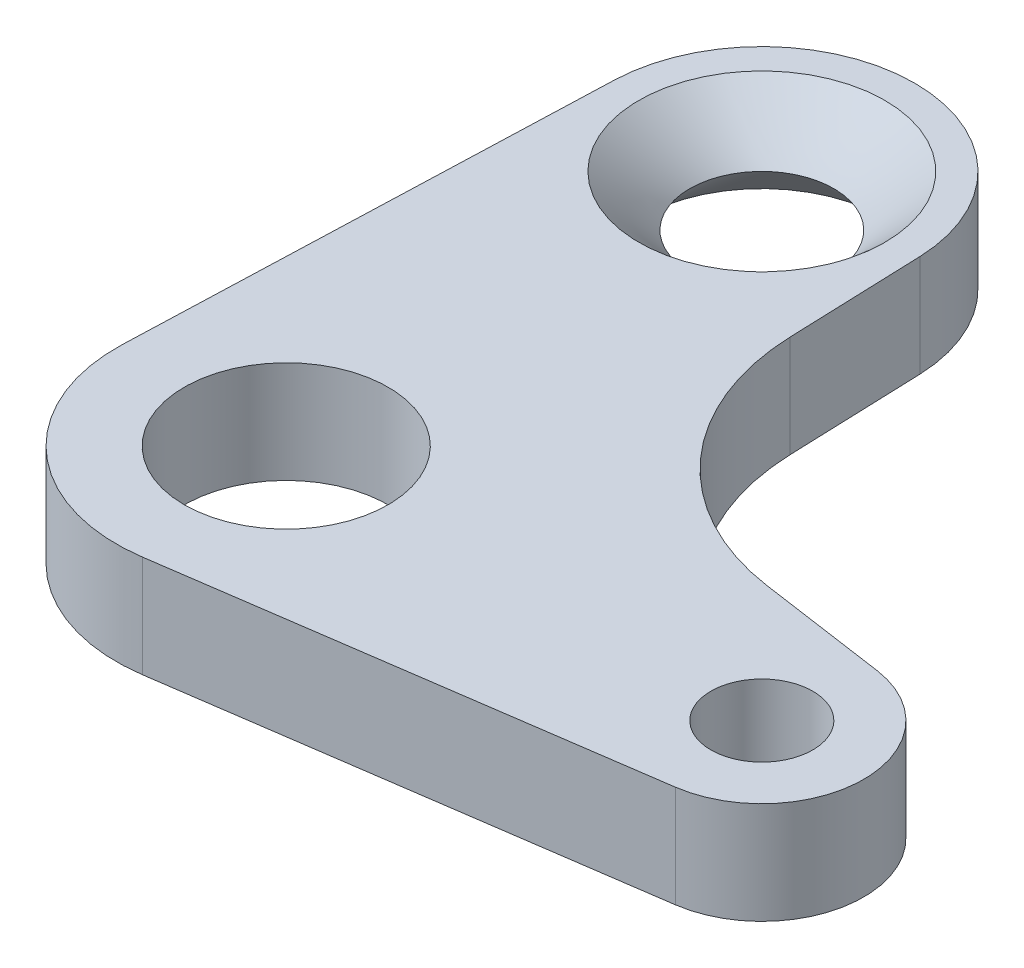
ISO-10303-21;
HEADER;
FILE_DESCRIPTION(('STEP AP214'),'2;1');
FILE_NAME('part.step','',(''),(''),'','','');
FILE_SCHEMA(('AUTOMOTIVE_DESIGN { 1 0 10303 214 1 1 1 1 }'));
ENDSEC;
DATA;
#1=APPLICATION_CONTEXT('core data for automotive mechanical design processes');
#2=APPLICATION_PROTOCOL_DEFINITION('international standard','automotive_design',2000,#1);
#3=PRODUCT_CONTEXT('',#1,'mechanical');
#4=PRODUCT('Part','Part','',(#3));
#5=PRODUCT_RELATED_PRODUCT_CATEGORY('part','',(#4));
#6=PRODUCT_DEFINITION_FORMATION('','',#4);
#7=PRODUCT_DEFINITION_CONTEXT('part definition',#1,'design');
#8=PRODUCT_DEFINITION('design','',#6,#7);
#9=PRODUCT_DEFINITION_SHAPE('','',#8);
#10=(LENGTH_UNIT() NAMED_UNIT(*) SI_UNIT(.MILLI.,.METRE.));
#11=(NAMED_UNIT(*) PLANE_ANGLE_UNIT() SI_UNIT($,.RADIAN.));
#12=(NAMED_UNIT(*) SI_UNIT($,.STERADIAN.) SOLID_ANGLE_UNIT());
#13=UNCERTAINTY_MEASURE_WITH_UNIT(LENGTH_MEASURE(1.E-05),#10,'distance_accuracy_value','');
#14=(GEOMETRIC_REPRESENTATION_CONTEXT(3) GLOBAL_UNCERTAINTY_ASSIGNED_CONTEXT((#13)) GLOBAL_UNIT_ASSIGNED_CONTEXT((#10,
#11,#12)) REPRESENTATION_CONTEXT('',''));
#15=CARTESIAN_POINT('',(0.,0.,0.));
#16=DIRECTION('',(0.,0.,1.));
#17=DIRECTION('',(1.,0.,0.));
#18=AXIS2_PLACEMENT_3D('',#15,#16,#17);
#19=CARTESIAN_POINT('',(0.,1.5,-14.));
#20=DIRECTION('',(0.,1.,0.));
#21=DIRECTION('',(0.,0.,1.));
#22=AXIS2_PLACEMENT_3D('',#19,#20,#21);
#23=PLANE('',#22);
#24=CARTESIAN_POINT('',(0.,1.5,-14.));
#25=DIRECTION('',(0.,1.,0.));
#26=DIRECTION('',(0.,0.,1.));
#27=AXIS2_PLACEMENT_3D('',#24,#25,#26);
#28=CIRCLE('',#27,3.6213);
#29=CARTESIAN_POINT('',(-3.05145372455657,1.5,-15.9499856042776));
#30=VERTEX_POINT('',#29);
#31=EDGE_CURVE('E155',#30,#30,#28,.T.);
#32=ORIENTED_EDGE('',*,*,#31,.F.);
#33=EDGE_LOOP('',(#32));
#34=FACE_BOUND('',#33,.T.);
#35=CARTESIAN_POINT('',(0.,1.5,0.));
#36=DIRECTION('',(0.,1.,0.));
#37=DIRECTION('',(0.,0.,1.));
#38=AXIS2_PLACEMENT_3D('',#35,#36,#37);
#39=CIRCLE('',#38,3.);
#40=CARTESIAN_POINT('',(0.,1.5,3.));
#41=VERTEX_POINT('',#40);
#42=EDGE_CURVE('E350',#41,#41,#39,.T.);
#43=ORIENTED_EDGE('',*,*,#42,.F.);
#44=EDGE_LOOP('',(#43));
#45=FACE_BOUND('',#44,.T.);
#46=CARTESIAN_POINT('',(0.,1.5,-14.));
#47=DIRECTION('',(0.,1.,0.));
#48=DIRECTION('',(0.,0.,1.));
#49=AXIS2_PLACEMENT_3D('',#46,#47,#48);
#50=CIRCLE('',#49,4.5);
#51=CARTESIAN_POINT('',(4.49712918631068,1.5,-14.1607142857143));
#52=VERTEX_POINT('',#51);
#53=CARTESIAN_POINT('',(-4.49712918631068,1.5,-14.1607142857143));
#54=VERTEX_POINT('',#53);
#55=EDGE_CURVE('E125',#52,#54,#50,.T.);
#56=ORIENTED_EDGE('',*,*,#55,.T.);
#57=DIRECTION('',(-0.0357142857142858,0.,0.999362041402373));
#58=VECTOR('',#57,1.);
#59=CARTESIAN_POINT('',(-4.49712918631068,1.5,-14.1607142857143));
#60=LINE('',#59,#58);
#61=CARTESIAN_POINT('',(-4.99681020701187,1.5,-0.17857142857143));
#62=VERTEX_POINT('',#61);
#63=EDGE_CURVE('E113',#54,#62,#60,.T.);
#64=ORIENTED_EDGE('',*,*,#63,.T.);
#65=CARTESIAN_POINT('',(0.,1.5,0.));
#66=DIRECTION('',(0.,1.,0.));
#67=DIRECTION('',(0.,0.,1.));
#68=AXIS2_PLACEMENT_3D('',#65,#66,#67);
#69=CIRCLE('',#68,5.);
#70=CARTESIAN_POINT('',(0.714285714285717,1.5,4.94871659305394));
#71=VERTEX_POINT('',#70);
#72=EDGE_CURVE('E124',#62,#71,#69,.T.);
#73=ORIENTED_EDGE('',*,*,#72,.T.);
#74=DIRECTION('',(0.989743318610787,0.,-0.142857142857143));
#75=VECTOR('',#74,1.);
#76=CARTESIAN_POINT('',(0.714285714285715,1.5,4.94871659305394));
#77=LINE('',#76,#75);
#78=CARTESIAN_POINT('',(14.4285714285714,1.5,2.96922995583236));
#79=VERTEX_POINT('',#78);
#80=EDGE_CURVE('E359',#71,#79,#77,.T.);
#81=ORIENTED_EDGE('',*,*,#80,.T.);
#82=CARTESIAN_POINT('',(14.,1.5,0.));
#83=DIRECTION('',(0.,1.,0.));
#84=DIRECTION('',(0.,0.,1.));
#85=AXIS2_PLACEMENT_3D('',#82,#83,#84);
#86=CIRCLE('',#85,3.);
#87=CARTESIAN_POINT('',(14.4285714285714,1.5,-2.96922995583236));
#88=VERTEX_POINT('',#87);
#89=EDGE_CURVE('E362',#79,#88,#86,.T.);
#90=ORIENTED_EDGE('',*,*,#89,.T.);
#91=DIRECTION('',(-0.989743318610787,0.,-0.142857142857143));
#92=VECTOR('',#91,1.);
#93=CARTESIAN_POINT('',(14.4285714285714,1.5,-2.96922995583236));
#94=LINE('',#93,#92);
#95=CARTESIAN_POINT('',(10.6343837908961,1.5,-3.51687376932432));
#96=VERTEX_POINT('',#95);
#97=EDGE_CURVE('E365',#88,#96,#94,.T.);
#98=ORIENTED_EDGE('',*,*,#97,.T.);
#99=CARTESIAN_POINT('',(11.6343837908961,1.5,-10.4450769995998));
#100=DIRECTION('',(0.,1.,0.));
#101=DIRECTION('',(0.,0.,1.));
#102=AXIS2_PLACEMENT_3D('',#99,#100,#101);
#103=CIRCLE('',#102,7.);
#104=CARTESIAN_POINT('',(4.63884950107946,1.5,-10.1950769995998));
#105=VERTEX_POINT('',#104);
#106=EDGE_CURVE('E12',#96,#105,#103,.F.);
#107=ORIENTED_EDGE('',*,*,#106,.T.);
#108=DIRECTION('',(-0.0357142857142856,0.,-0.999362041402373));
#109=VECTOR('',#108,1.);
#110=CARTESIAN_POINT('',(4.49712918631068,1.5,-14.1607142857143));
#111=LINE('',#110,#109);
#112=EDGE_CURVE('E130',#105,#52,#111,.T.);
#113=ORIENTED_EDGE('',*,*,#112,.T.);
#114=EDGE_LOOP('',(#56,#64,#73,#81,#90,#98,#107,#113));
#115=FACE_BOUND('',#114,.T.);
#116=CARTESIAN_POINT('',(14.,1.5,0.));
#117=DIRECTION('',(0.,1.,0.));
#118=DIRECTION('',(0.,0.,1.));
#119=AXIS2_PLACEMENT_3D('',#116,#117,#118);
#120=CIRCLE('',#119,1.5);
#121=CARTESIAN_POINT('',(14.,1.5,1.5));
#122=VERTEX_POINT('',#121);
#123=EDGE_CURVE('E342',#122,#122,#120,.T.);
#124=ORIENTED_EDGE('',*,*,#123,.F.);
#125=EDGE_LOOP('',(#124));
#126=FACE_BOUND('',#125,.T.);
#127=ADVANCED_FACE('F43',(#34,#45,#115,#126),#23,.T.);
#128=CARTESIAN_POINT('',(0.,-1.5,-14.));
#129=DIRECTION('',(0.,1.,0.));
#130=DIRECTION('',(0.,0.,1.));
#131=AXIS2_PLACEMENT_3D('',#128,#129,#130);
#132=PLANE('',#131);
#133=CARTESIAN_POINT('',(0.,-1.5,-14.));
#134=DIRECTION('',(0.,1.,0.));
#135=DIRECTION('',(0.,0.,1.));
#136=AXIS2_PLACEMENT_3D('',#133,#134,#135);
#137=CIRCLE('',#136,3.6213);
#138=CARTESIAN_POINT('',(-3.05145372455657,-1.5,-15.9499856042776));
#139=VERTEX_POINT('',#138);
#140=EDGE_CURVE('E313',#139,#139,#137,.T.);
#141=ORIENTED_EDGE('',*,*,#140,.T.);
#142=EDGE_LOOP('',(#141));
#143=FACE_BOUND('',#142,.T.);
#144=CARTESIAN_POINT('',(0.,-1.5,-14.));
#145=DIRECTION('',(0.,1.,0.));
#146=DIRECTION('',(0.,0.,1.));
#147=AXIS2_PLACEMENT_3D('',#144,#145,#146);
#148=CIRCLE('',#147,4.5);
#149=CARTESIAN_POINT('',(4.49712918631068,-1.5,-14.1607142857143));
#150=VERTEX_POINT('',#149);
#151=CARTESIAN_POINT('',(-4.49712918631068,-1.5,-14.1607142857143));
#152=VERTEX_POINT('',#151);
#153=EDGE_CURVE('E139',#150,#152,#148,.T.);
#154=ORIENTED_EDGE('',*,*,#153,.F.);
#155=DIRECTION('',(-0.0357142857142856,0.,-0.999362041402373));
#156=VECTOR('',#155,1.);
#157=CARTESIAN_POINT('',(4.49712918631068,-1.5,-14.1607142857143));
#158=LINE('',#157,#156);
#159=CARTESIAN_POINT('',(4.63884950107946,-1.5,-10.1950769995998));
#160=VERTEX_POINT('',#159);
#161=EDGE_CURVE('E135',#160,#150,#158,.T.);
#162=ORIENTED_EDGE('',*,*,#161,.F.);
#163=CARTESIAN_POINT('',(11.6343837908961,-1.5,-10.4450769995998));
#164=DIRECTION('',(0.,1.,0.));
#165=DIRECTION('',(0.,0.,1.));
#166=AXIS2_PLACEMENT_3D('',#163,#164,#165);
#167=CIRCLE('',#166,7.);
#168=CARTESIAN_POINT('',(10.6343837908961,-1.5,-3.51687376932432));
#169=VERTEX_POINT('',#168);
#170=EDGE_CURVE('E55',#160,#169,#167,.T.);
#171=ORIENTED_EDGE('',*,*,#170,.T.);
#172=DIRECTION('',(-0.989743318610787,0.,-0.142857142857143));
#173=VECTOR('',#172,1.);
#174=CARTESIAN_POINT('',(14.4285714285714,-1.5,-2.96922995583236));
#175=LINE('',#174,#173);
#176=CARTESIAN_POINT('',(14.4285714285714,-1.5,-2.96922995583236));
#177=VERTEX_POINT('',#176);
#178=EDGE_CURVE('E385',#177,#169,#175,.T.);
#179=ORIENTED_EDGE('',*,*,#178,.F.);
#180=CARTESIAN_POINT('',(14.,-1.5,0.));
#181=DIRECTION('',(0.,1.,0.));
#182=DIRECTION('',(0.,0.,1.));
#183=AXIS2_PLACEMENT_3D('',#180,#181,#182);
#184=CIRCLE('',#183,3.);
#185=CARTESIAN_POINT('',(14.4285714285714,-1.5,2.96922995583236));
#186=VERTEX_POINT('',#185);
#187=EDGE_CURVE('E382',#186,#177,#184,.T.);
#188=ORIENTED_EDGE('',*,*,#187,.F.);
#189=DIRECTION('',(0.989743318610787,0.,-0.142857142857143));
#190=VECTOR('',#189,1.);
#191=CARTESIAN_POINT('',(0.714285714285715,-1.5,4.94871659305394));
#192=LINE('',#191,#190);
#193=CARTESIAN_POINT('',(0.714285714285717,-1.5,4.94871659305394));
#194=VERTEX_POINT('',#193);
#195=EDGE_CURVE('E379',#194,#186,#192,.T.);
#196=ORIENTED_EDGE('',*,*,#195,.F.);
#197=CARTESIAN_POINT('',(0.,-1.5,0.));
#198=DIRECTION('',(0.,1.,0.));
#199=DIRECTION('',(0.,0.,1.));
#200=AXIS2_PLACEMENT_3D('',#197,#198,#199);
#201=CIRCLE('',#200,5.);
#202=CARTESIAN_POINT('',(-4.99681020701187,-1.5,-0.17857142857143));
#203=VERTEX_POINT('',#202);
#204=EDGE_CURVE('E376',#203,#194,#201,.T.);
#205=ORIENTED_EDGE('',*,*,#204,.F.);
#206=DIRECTION('',(-0.0357142857142858,0.,0.999362041402373));
#207=VECTOR('',#206,1.);
#208=CARTESIAN_POINT('',(-4.49712918631068,-1.5,-14.1607142857143));
#209=LINE('',#208,#207);
#210=EDGE_CURVE('E373',#152,#203,#209,.T.);
#211=ORIENTED_EDGE('',*,*,#210,.F.);
#212=EDGE_LOOP('',(#154,#162,#171,#179,#188,#196,#205,#211));
#213=FACE_BOUND('',#212,.T.);
#214=CARTESIAN_POINT('',(0.,-1.5,0.));
#215=DIRECTION('',(0.,1.,0.));
#216=DIRECTION('',(0.,0.,1.));
#217=AXIS2_PLACEMENT_3D('',#214,#215,#216);
#218=CIRCLE('',#217,3.);
#219=CARTESIAN_POINT('',(0.,-1.5,3.));
#220=VERTEX_POINT('',#219);
#221=EDGE_CURVE('E346',#220,#220,#218,.T.);
#222=ORIENTED_EDGE('',*,*,#221,.T.);
#223=EDGE_LOOP('',(#222));
#224=FACE_BOUND('',#223,.T.);
#225=CARTESIAN_POINT('',(14.,-1.5,0.));
#226=DIRECTION('',(0.,1.,0.));
#227=DIRECTION('',(0.,0.,1.));
#228=AXIS2_PLACEMENT_3D('',#225,#226,#227);
#229=CIRCLE('',#228,1.5);
#230=CARTESIAN_POINT('',(14.,-1.5,1.5));
#231=VERTEX_POINT('',#230);
#232=EDGE_CURVE('E339',#231,#231,#229,.T.);
#233=ORIENTED_EDGE('',*,*,#232,.T.);
#234=EDGE_LOOP('',(#233));
#235=FACE_BOUND('',#234,.T.);
#236=ADVANCED_FACE('F168',(#143,#213,#224,#235),#132,.F.);
#237=CARTESIAN_POINT('',(0.,1.5,-14.));
#238=DIRECTION('',(0.,-1.,0.));
#239=DIRECTION('',(0.,0.,-1.));
#240=AXIS2_PLACEMENT_3D('',#237,#238,#239);
#241=CYLINDRICAL_SURFACE('',#240,4.5);
#242=ORIENTED_EDGE('',*,*,#153,.T.);
#243=DIRECTION('',(0.,-1.,0.));
#244=VECTOR('',#243,1.);
#245=CARTESIAN_POINT('',(-4.49712918631068,1.5,-14.1607142857143));
#246=LINE('',#245,#244);
#247=EDGE_CURVE('E117',#54,#152,#246,.T.);
#248=ORIENTED_EDGE('',*,*,#247,.F.);
#249=ORIENTED_EDGE('',*,*,#55,.F.);
#250=DIRECTION('',(0.,-1.,0.));
#251=VECTOR('',#250,1.);
#252=CARTESIAN_POINT('',(4.49712918631068,1.5,-14.1607142857143));
#253=LINE('',#252,#251);
#254=EDGE_CURVE('E370',#52,#150,#253,.T.);
#255=ORIENTED_EDGE('',*,*,#254,.T.);
#256=EDGE_LOOP('',(#242,#248,#249,#255));
#257=FACE_BOUND('',#256,.T.);
#258=ADVANCED_FACE('F137',(#257),#241,.T.);
#259=CARTESIAN_POINT('',(-4.49712918631068,1.5,-14.1607142857143));
#260=DIRECTION('',(0.999362041402373,0.,0.0357142857142858));
#261=DIRECTION('',(0.0357142857142858,0.,-0.999362041402373));
#262=AXIS2_PLACEMENT_3D('',#259,#260,#261);
#263=PLANE('',#262);
#264=ORIENTED_EDGE('',*,*,#210,.T.);
#265=DIRECTION('',(0.,-1.,0.));
#266=VECTOR('',#265,1.);
#267=CARTESIAN_POINT('',(-4.99681020701187,1.5,-0.17857142857143));
#268=LINE('',#267,#266);
#269=EDGE_CURVE('E120',#62,#203,#268,.T.);
#270=ORIENTED_EDGE('',*,*,#269,.F.);
#271=ORIENTED_EDGE('',*,*,#63,.F.);
#272=ORIENTED_EDGE('',*,*,#247,.T.);
#273=EDGE_LOOP('',(#264,#270,#271,#272));
#274=FACE_BOUND('',#273,.T.);
#275=ADVANCED_FACE('F115',(#274),#263,.F.);
#276=CARTESIAN_POINT('',(0.,1.5,0.));
#277=DIRECTION('',(0.,-1.,0.));
#278=DIRECTION('',(0.,0.,-1.));
#279=AXIS2_PLACEMENT_3D('',#276,#277,#278);
#280=CYLINDRICAL_SURFACE('',#279,5.);
#281=ORIENTED_EDGE('',*,*,#204,.T.);
#282=DIRECTION('',(0.,-1.,0.));
#283=VECTOR('',#282,1.);
#284=CARTESIAN_POINT('',(0.714285714285717,1.5,4.94871659305394));
#285=LINE('',#284,#283);
#286=EDGE_CURVE('E147',#71,#194,#285,.T.);
#287=ORIENTED_EDGE('',*,*,#286,.F.);
#288=ORIENTED_EDGE('',*,*,#72,.F.);
#289=ORIENTED_EDGE('',*,*,#269,.T.);
#290=EDGE_LOOP('',(#281,#287,#288,#289));
#291=FACE_BOUND('',#290,.T.);
#292=ADVANCED_FACE('F189',(#291),#280,.T.);
#293=CARTESIAN_POINT('',(0.714285714285715,1.5,4.94871659305394));
#294=DIRECTION('',(-0.142857142857143,0.,-0.989743318610787));
#295=DIRECTION('',(-0.989743318610787,0.,0.142857142857143));
#296=AXIS2_PLACEMENT_3D('',#293,#294,#295);
#297=PLANE('',#296);
#298=ORIENTED_EDGE('',*,*,#195,.T.);
#299=DIRECTION('',(0.,-1.,0.));
#300=VECTOR('',#299,1.);
#301=CARTESIAN_POINT('',(14.4285714285714,1.5,2.96922995583236));
#302=LINE('',#301,#300);
#303=EDGE_CURVE('E396',#79,#186,#302,.T.);
#304=ORIENTED_EDGE('',*,*,#303,.F.);
#305=ORIENTED_EDGE('',*,*,#80,.F.);
#306=ORIENTED_EDGE('',*,*,#286,.T.);
#307=EDGE_LOOP('',(#298,#304,#305,#306));
#308=FACE_BOUND('',#307,.T.);
#309=ADVANCED_FACE('F185',(#308),#297,.F.);
#310=CARTESIAN_POINT('',(14.,1.5,0.));
#311=DIRECTION('',(0.,-1.,0.));
#312=DIRECTION('',(0.,0.,-1.));
#313=AXIS2_PLACEMENT_3D('',#310,#311,#312);
#314=CYLINDRICAL_SURFACE('',#313,3.);
#315=ORIENTED_EDGE('',*,*,#187,.T.);
#316=DIRECTION('',(0.,-1.,0.));
#317=VECTOR('',#316,1.);
#318=CARTESIAN_POINT('',(14.4285714285714,1.5,-2.96922995583236));
#319=LINE('',#318,#317);
#320=EDGE_CURVE('E392',#88,#177,#319,.T.);
#321=ORIENTED_EDGE('',*,*,#320,.F.);
#322=ORIENTED_EDGE('',*,*,#89,.F.);
#323=ORIENTED_EDGE('',*,*,#303,.T.);
#324=EDGE_LOOP('',(#315,#321,#322,#323));
#325=FACE_BOUND('',#324,.T.);
#326=ADVANCED_FACE('F182',(#325),#314,.T.);
#327=CARTESIAN_POINT('',(14.4285714285714,1.5,-2.96922995583236));
#328=DIRECTION('',(-0.142857142857143,0.,0.989743318610787));
#329=DIRECTION('',(0.989743318610787,0.,0.142857142857143));
#330=AXIS2_PLACEMENT_3D('',#327,#328,#329);
#331=PLANE('',#330);
#332=ORIENTED_EDGE('',*,*,#178,.T.);
#333=DIRECTION('',(0.,-1.,0.));
#334=VECTOR('',#333,1.);
#335=CARTESIAN_POINT('',(10.6343837908961,1.5,-3.51687376932432));
#336=LINE('',#335,#334);
#337=EDGE_CURVE('E63',#169,#96,#336,.F.);
#338=ORIENTED_EDGE('',*,*,#337,.T.);
#339=ORIENTED_EDGE('',*,*,#97,.F.);
#340=ORIENTED_EDGE('',*,*,#320,.T.);
#341=EDGE_LOOP('',(#332,#338,#339,#340));
#342=FACE_BOUND('',#341,.T.);
#343=ADVANCED_FACE('F178',(#342),#331,.F.);
#344=CARTESIAN_POINT('',(4.49712918631068,1.5,-14.1607142857143));
#345=DIRECTION('',(-0.999362041402373,0.,0.0357142857142856));
#346=DIRECTION('',(0.0357142857142856,0.,0.999362041402373));
#347=AXIS2_PLACEMENT_3D('',#344,#345,#346);
#348=PLANE('',#347);
#349=ORIENTED_EDGE('',*,*,#112,.F.);
#350=DIRECTION('',(0.,-1.,0.));
#351=VECTOR('',#350,1.);
#352=CARTESIAN_POINT('',(4.63884950107946,-1.5,-10.1950769995998));
#353=LINE('',#352,#351);
#354=EDGE_CURVE('E141',#105,#160,#353,.T.);
#355=ORIENTED_EDGE('',*,*,#354,.T.);
#356=ORIENTED_EDGE('',*,*,#161,.T.);
#357=ORIENTED_EDGE('',*,*,#254,.F.);
#358=EDGE_LOOP('',(#349,#355,#356,#357));
#359=FACE_BOUND('',#358,.T.);
#360=ADVANCED_FACE('F175',(#359),#348,.F.);
#361=CARTESIAN_POINT('',(0.,1.5,0.));
#362=DIRECTION('',(0.,-1.,0.));
#363=DIRECTION('',(0.,0.,-1.));
#364=AXIS2_PLACEMENT_3D('',#361,#362,#363);
#365=CYLINDRICAL_SURFACE('',#364,3.);
#366=ORIENTED_EDGE('',*,*,#42,.T.);
#367=EDGE_LOOP('',(#366));
#368=FACE_BOUND('',#367,.T.);
#369=ORIENTED_EDGE('',*,*,#221,.F.);
#370=EDGE_LOOP('',(#369));
#371=FACE_BOUND('',#370,.T.);
#372=ADVANCED_FACE('F169',(#368,#371),#365,.F.);
#373=CARTESIAN_POINT('',(14.,1.5,0.));
#374=DIRECTION('',(0.,-1.,0.));
#375=DIRECTION('',(0.,0.,-1.));
#376=AXIS2_PLACEMENT_3D('',#373,#374,#375);
#377=CYLINDRICAL_SURFACE('',#376,1.5);
#378=ORIENTED_EDGE('',*,*,#123,.T.);
#379=EDGE_LOOP('',(#378));
#380=FACE_BOUND('',#379,.T.);
#381=ORIENTED_EDGE('',*,*,#232,.F.);
#382=EDGE_LOOP('',(#381));
#383=FACE_BOUND('',#382,.T.);
#384=ADVANCED_FACE('F232',(#380,#383),#377,.F.);
#385=CARTESIAN_POINT('',(-3.05145372455657,1.5,-15.9499856042776));
#386=CARTESIAN_POINT('',(-1.17243992107477,0.,-15.7678753275812));
#387=CARTESIAN_POINT('',(0.8485174839986,1.5,-22.0528930533907));
#388=CARTESIAN_POINT('',(2.36331073408753,0.,-18.1127551697307));
#389=CARTESIAN_POINT('',(6.95142493311175,1.5,-18.1529218448356));
#390=CARTESIAN_POINT('',(4.70819057623709,0.,-14.5770045145684));
#391=CARTESIAN_POINT('',(3.05145372455658,1.5,-12.0500143957224));
#392=CARTESIAN_POINT('',(1.17243992107478,0.,-12.2321246724188));
#393=CARTESIAN_POINT('',(-0.84851748399859,1.5,-5.94710694660927));
#394=CARTESIAN_POINT('',(-2.36331073408753,0.,-9.8872448302693));
#395=CARTESIAN_POINT('',(-6.95142493311173,1.5,-9.84707815516444));
#396=CARTESIAN_POINT('',(-4.70819057623708,0.,-13.4229954854316));
#397=CARTESIAN_POINT('',(-3.05145372455657,1.5,-15.9499856042776));
#398=CARTESIAN_POINT('',(-1.17243992107477,0.,-15.7678753275812));
#399=(BOUNDED_SURFACE() B_SPLINE_SURFACE(3,1,((#385,#386),(#387,#388),(#389,#390),(#391,#392),
(#393,#394),(#395,#396),(#397,#398)),.UNSPECIFIED.,.T.,.F.,.F.) B_SPLINE_SURFACE_WITH_KNOTS((4,
3,4),(2,2),(0.,0.5,1.),(0.,1.),
.UNSPECIFIED.) GEOMETRIC_REPRESENTATION_ITEM() RATIONAL_B_SPLINE_SURFACE(((1.,1.),
(0.333333333333333,0.333333333333333),(0.333333333333333,0.333333333333333),(1.,1.),
(0.333333333333334,0.333333333333334),(0.333333333333334,0.333333333333334),(1.,1.))) REPRESENTATION_ITEM('') SURFACE());
#400=CARTESIAN_POINT('',(0.,0.,-14.));
#401=DIRECTION('',(0.,1.,0.));
#402=DIRECTION('',(0.,0.,1.));
#403=AXIS2_PLACEMENT_3D('',#400,#401,#402);
#404=CIRCLE('',#403,2.12132);
#405=CARTESIAN_POINT('',(-1.17243992107477,0.,-15.7678753275812));
#406=VERTEX_POINT('',#405);
#407=EDGE_CURVE('E322',#406,#406,#404,.T.);
#408=CARTESIAN_POINT('',(-3.05145372455657,1.5,-15.9499856042776));
#409=CARTESIAN_POINT('',(-3.03188066410363,1.484375,-15.9480886222287));
#410=CARTESIAN_POINT('',(-3.0123076036507,1.46875,-15.9461916401797));
#411=CARTESIAN_POINT('',(-2.97316148274483,1.4375,-15.9423976760819));
#412=CARTESIAN_POINT('',(-2.95358842229189,1.421875,-15.940500694033));
#413=CARTESIAN_POINT('',(-2.91444230138602,1.390625,-15.9367067299351));
#414=CARTESIAN_POINT('',(-2.89486924093309,1.375,-15.9348097478862));
#415=CARTESIAN_POINT('',(-2.85572312002722,1.34375,-15.9310157837884));
#416=CARTESIAN_POINT('',(-2.83615005957428,1.328125,-15.9291188017395));
#417=CARTESIAN_POINT('',(-2.79700393866841,1.296875,-15.9253248376416));
#418=CARTESIAN_POINT('',(-2.77743087821548,1.28125,-15.9234278555927));
#419=CARTESIAN_POINT('',(-2.7382847573096,1.25,-15.9196338914948));
#420=CARTESIAN_POINT('',(-2.71871169685667,1.234375,-15.9177369094459));
#421=CARTESIAN_POINT('',(-2.6795655759508,1.203125,-15.9139429453481));
#422=CARTESIAN_POINT('',(-2.65999251549786,1.1875,-15.9120459632992));
#423=CARTESIAN_POINT('',(-2.62084639459199,1.15625,-15.9082519992013));
#424=CARTESIAN_POINT('',(-2.60127333413906,1.140625,-15.9063550171524));
#425=CARTESIAN_POINT('',(-2.56212721323319,1.109375,-15.9025610530546));
#426=CARTESIAN_POINT('',(-2.54255415278025,1.09375,-15.9006640710056));
#427=CARTESIAN_POINT('',(-2.50340803187438,1.0625,-15.8968701069078));
#428=CARTESIAN_POINT('',(-2.48383497142144,1.046875,-15.8949731248589));
#429=CARTESIAN_POINT('',(-2.44468885051557,1.015625,-15.891179160761));
#430=CARTESIAN_POINT('',(-2.42511579006264,1.,-15.8892821787121));
#431=CARTESIAN_POINT('',(-2.38596966915677,0.96875,-15.8854882146143));
#432=CARTESIAN_POINT('',(-2.36639660870383,0.953125,-15.8835912325653));
#433=CARTESIAN_POINT('',(-2.32725048779796,0.921875,-15.8797972684675));
#434=CARTESIAN_POINT('',(-2.30767742734503,0.90625,-15.8779002864186));
#435=CARTESIAN_POINT('',(-2.26853130643916,0.875,-15.8741063223207));
#436=CARTESIAN_POINT('',(-2.24895824598622,0.859375,-15.8722093402718));
#437=CARTESIAN_POINT('',(-2.20981212508035,0.828125,-15.868415376174));
#438=CARTESIAN_POINT('',(-2.19023906462741,0.8125,-15.8665183941251));
#439=CARTESIAN_POINT('',(-2.15109294372154,0.78125,-15.8627244300272));
#440=CARTESIAN_POINT('',(-2.13151988326861,0.765625,-15.8608274479783));
#441=CARTESIAN_POINT('',(-2.09237376236274,0.734375,-15.8570334838805));
#442=CARTESIAN_POINT('',(-2.0728007019098,0.71875,-15.8551365018315));
#443=CARTESIAN_POINT('',(-2.03365458100393,0.6875,-15.8513425377337));
#444=CARTESIAN_POINT('',(-2.014081520551,0.671875,-15.8494455556848));
#445=CARTESIAN_POINT('',(-1.97493539964512,0.640625,-15.8456515915869));
#446=CARTESIAN_POINT('',(-1.95536233919219,0.625,-15.843754609538));
#447=CARTESIAN_POINT('',(-1.91621621828632,0.59375,-15.8399606454402));
#448=CARTESIAN_POINT('',(-1.89664315783338,0.578125,-15.8380636633912));
#449=CARTESIAN_POINT('',(-1.85749703692751,0.546875,-15.8342696992934));
#450=CARTESIAN_POINT('',(-1.83792397647458,0.53125,-15.8323727172445));
#451=CARTESIAN_POINT('',(-1.79877785556871,0.5,-15.8285787531466));
#452=CARTESIAN_POINT('',(-1.77920479511577,0.484375,-15.8266817710977));
#453=CARTESIAN_POINT('',(-1.7400586742099,0.453125,-15.8228878069999));
#454=CARTESIAN_POINT('',(-1.72048561375696,0.4375,-15.8209908249509));
#455=CARTESIAN_POINT('',(-1.68133949285109,0.40625,-15.8171968608531));
#456=CARTESIAN_POINT('',(-1.66176643239816,0.390625,-15.8152998788042));
#457=CARTESIAN_POINT('',(-1.62262031149229,0.359375,-15.8115059147063));
#458=CARTESIAN_POINT('',(-1.60304725103935,0.34375,-15.8096089326574));
#459=CARTESIAN_POINT('',(-1.56390113013348,0.3125,-15.8058149685596));
#460=CARTESIAN_POINT('',(-1.54432806968055,0.296875,-15.8039179865107));
#461=CARTESIAN_POINT('',(-1.50518194877468,0.265625,-15.8001240224128));
#462=CARTESIAN_POINT('',(-1.48560888832174,0.25,-15.7982270403639));
#463=CARTESIAN_POINT('',(-1.44646276741587,0.21875,-15.794433076266));
#464=CARTESIAN_POINT('',(-1.42688970696293,0.203125,-15.7925360942171));
#465=CARTESIAN_POINT('',(-1.38774358605706,0.171875,-15.7887421301193));
#466=CARTESIAN_POINT('',(-1.36817052560413,0.15625,-15.7868451480704));
#467=CARTESIAN_POINT('',(-1.32902440469826,0.125,-15.7830511839725));
#468=CARTESIAN_POINT('',(-1.30945134424532,0.109375,-15.7811542019236));
#469=CARTESIAN_POINT('',(-1.27030522333945,0.0781249999999999,-15.7773602378258));
#470=CARTESIAN_POINT('',(-1.25073216288651,0.0625,-15.7754632557768));
#471=CARTESIAN_POINT('',(-1.21158604198064,0.0312500000000001,-15.771669291679));
#472=CARTESIAN_POINT('',(-1.19201298152771,0.0156250000000001,-15.7697723096301));
#473=CARTESIAN_POINT('',(-1.17243992107477,0.,-15.7678753275812));
#474=B_SPLINE_CURVE_WITH_KNOTS('',3,(#408,#409,#410,#411,#412,#413,#414,#415,#416,#417,#418,
#419,#420,#421,#422,#423,#424,#425,#426,#427,#428,#429,#430,#431,#432,#433,#434,#435,#436,#437,
#438,#439,#440,#441,#442,#443,#444,#445,#446,#447,#448,#449,#450,#451,#452,#453,#454,#455,#456,
#457,#458,#459,#460,#461,#462,#463,#464,#465,#466,#467,#468,#469,#470,#471,#472,#473),
.UNSPECIFIED.,.F.,.F.,(4,2,2,2,2,2,2,2,2,2,2,2,2,2,2,2,2,2,2,2,2,2,2,2,2,2,2,2,2,2,2,2,4),(0.,
0.0753498158756462,0.150699631751291,0.226049447626937,0.301399263502583,0.376749079378229,
0.452098895253875,0.527448711129521,0.602798527005167,0.678148342880813,0.753498158756458,
0.828847974632105,0.90419779050775,0.979547606383396,1.05489742225904,1.13024723813469,
1.20559705401033,1.28094686988598,1.35629668576163,1.43164650163727,1.50699631751292,
1.58234613338856,1.65769594926421,1.73304576513985,1.8083955810155,1.88374539689115,
1.95909521276679,2.03444502864244,2.10979484451808,2.18514466039373,2.26049447626938,
2.33584429214502,2.41119410802067),.UNSPECIFIED.);
#475=EDGE_CURVE('BSEAM239',#30,#406,#474,.T.);
#476=ORIENTED_EDGE('',*,*,#31,.T.);
#477=ORIENTED_EDGE('',*,*,#407,.F.);
#478=ORIENTED_EDGE('',*,*,#475,.T.);
#479=ORIENTED_EDGE('',*,*,#475,.F.);
#480=EDGE_LOOP('',(#476,#478,#477,#479));
#481=FACE_BOUND('',#480,.T.);
#482=ADVANCED_FACE('F239',(#481),#399,.F.);
#483=CARTESIAN_POINT('',(11.6343837908961,1.5,-10.4450769995998));
#484=DIRECTION('',(0.,1.,0.));
#485=DIRECTION('',(0.,0.,1.));
#486=AXIS2_PLACEMENT_3D('',#483,#484,#485);
#487=CYLINDRICAL_SURFACE('',#486,7.);
#488=ORIENTED_EDGE('',*,*,#106,.F.);
#489=ORIENTED_EDGE('',*,*,#337,.F.);
#490=ORIENTED_EDGE('',*,*,#170,.F.);
#491=ORIENTED_EDGE('',*,*,#354,.F.);
#492=EDGE_LOOP('',(#488,#489,#490,#491));
#493=FACE_BOUND('',#492,.T.);
#494=ADVANCED_FACE('F45',(#493),#487,.F.);
#495=CARTESIAN_POINT('',(-3.05145372455657,-1.5,-15.9499856042776));
#496=CARTESIAN_POINT('',(-1.17243992107477,0.,-15.7678753275812));
#497=CARTESIAN_POINT('',(0.8485174839986,-1.5,-22.0528930533907));
#498=CARTESIAN_POINT('',(2.36331073408753,0.,-18.1127551697307));
#499=CARTESIAN_POINT('',(6.95142493311175,-1.5,-18.1529218448356));
#500=CARTESIAN_POINT('',(4.70819057623709,0.,-14.5770045145684));
#501=CARTESIAN_POINT('',(3.05145372455658,-1.5,-12.0500143957224));
#502=CARTESIAN_POINT('',(1.17243992107478,0.,-12.2321246724188));
#503=CARTESIAN_POINT('',(-0.84851748399859,-1.5,-5.94710694660927));
#504=CARTESIAN_POINT('',(-2.36331073408753,0.,-9.8872448302693));
#505=CARTESIAN_POINT('',(-6.95142493311173,-1.5,-9.84707815516444));
#506=CARTESIAN_POINT('',(-4.70819057623708,0.,-13.4229954854316));
#507=CARTESIAN_POINT('',(-3.05145372455657,-1.5,-15.9499856042776));
#508=CARTESIAN_POINT('',(-1.17243992107477,0.,-15.7678753275812));
#509=(BOUNDED_SURFACE() B_SPLINE_SURFACE(3,1,((#495,#496),(#497,#498),(#499,#500),(#501,#502),
(#503,#504),(#505,#506),(#507,#508)),.UNSPECIFIED.,.T.,.F.,.F.) B_SPLINE_SURFACE_WITH_KNOTS((4,
3,4),(2,2),(0.,0.5,1.),(0.,1.),
.UNSPECIFIED.) GEOMETRIC_REPRESENTATION_ITEM() RATIONAL_B_SPLINE_SURFACE(((1.,1.),
(0.333333333333333,0.333333333333333),(0.333333333333333,0.333333333333333),(1.,1.),
(0.333333333333334,0.333333333333334),(0.333333333333334,0.333333333333334),(1.,1.))) REPRESENTATION_ITEM('') SURFACE());
#510=CARTESIAN_POINT('',(-3.05145372455657,-1.5,-15.9499856042776));
#511=CARTESIAN_POINT('',(-3.03188066410363,-1.484375,-15.9480886222287));
#512=CARTESIAN_POINT('',(-3.0123076036507,-1.46875,-15.9461916401797));
#513=CARTESIAN_POINT('',(-2.97316148274483,-1.4375,-15.9423976760819));
#514=CARTESIAN_POINT('',(-2.95358842229189,-1.421875,-15.940500694033));
#515=CARTESIAN_POINT('',(-2.91444230138602,-1.390625,-15.9367067299351));
#516=CARTESIAN_POINT('',(-2.89486924093309,-1.375,-15.9348097478862));
#517=CARTESIAN_POINT('',(-2.85572312002722,-1.34375,-15.9310157837884));
#518=CARTESIAN_POINT('',(-2.83615005957428,-1.328125,-15.9291188017395));
#519=CARTESIAN_POINT('',(-2.79700393866841,-1.296875,-15.9253248376416));
#520=CARTESIAN_POINT('',(-2.77743087821548,-1.28125,-15.9234278555927));
#521=CARTESIAN_POINT('',(-2.7382847573096,-1.25,-15.9196338914948));
#522=CARTESIAN_POINT('',(-2.71871169685667,-1.234375,-15.9177369094459));
#523=CARTESIAN_POINT('',(-2.6795655759508,-1.203125,-15.9139429453481));
#524=CARTESIAN_POINT('',(-2.65999251549786,-1.1875,-15.9120459632992));
#525=CARTESIAN_POINT('',(-2.62084639459199,-1.15625,-15.9082519992013));
#526=CARTESIAN_POINT('',(-2.60127333413906,-1.140625,-15.9063550171524));
#527=CARTESIAN_POINT('',(-2.56212721323319,-1.109375,-15.9025610530546));
#528=CARTESIAN_POINT('',(-2.54255415278025,-1.09375,-15.9006640710056));
#529=CARTESIAN_POINT('',(-2.50340803187438,-1.0625,-15.8968701069078));
#530=CARTESIAN_POINT('',(-2.48383497142144,-1.046875,-15.8949731248589));
#531=CARTESIAN_POINT('',(-2.44468885051557,-1.015625,-15.891179160761));
#532=CARTESIAN_POINT('',(-2.42511579006264,-1.,-15.8892821787121));
#533=CARTESIAN_POINT('',(-2.38596966915677,-0.96875,-15.8854882146143));
#534=CARTESIAN_POINT('',(-2.36639660870383,-0.953125,-15.8835912325653));
#535=CARTESIAN_POINT('',(-2.32725048779796,-0.921875,-15.8797972684675));
#536=CARTESIAN_POINT('',(-2.30767742734503,-0.90625,-15.8779002864186));
#537=CARTESIAN_POINT('',(-2.26853130643916,-0.875,-15.8741063223207));
#538=CARTESIAN_POINT('',(-2.24895824598622,-0.859375,-15.8722093402718));
#539=CARTESIAN_POINT('',(-2.20981212508035,-0.828125,-15.868415376174));
#540=CARTESIAN_POINT('',(-2.19023906462741,-0.8125,-15.8665183941251));
#541=CARTESIAN_POINT('',(-2.15109294372154,-0.78125,-15.8627244300272));
#542=CARTESIAN_POINT('',(-2.13151988326861,-0.765625,-15.8608274479783));
#543=CARTESIAN_POINT('',(-2.09237376236274,-0.734375,-15.8570334838805));
#544=CARTESIAN_POINT('',(-2.0728007019098,-0.71875,-15.8551365018315));
#545=CARTESIAN_POINT('',(-2.03365458100393,-0.6875,-15.8513425377337));
#546=CARTESIAN_POINT('',(-2.014081520551,-0.671875,-15.8494455556848));
#547=CARTESIAN_POINT('',(-1.97493539964512,-0.640625,-15.8456515915869));
#548=CARTESIAN_POINT('',(-1.95536233919219,-0.625,-15.843754609538));
#549=CARTESIAN_POINT('',(-1.91621621828632,-0.59375,-15.8399606454402));
#550=CARTESIAN_POINT('',(-1.89664315783338,-0.578125,-15.8380636633912));
#551=CARTESIAN_POINT('',(-1.85749703692751,-0.546875,-15.8342696992934));
#552=CARTESIAN_POINT('',(-1.83792397647458,-0.53125,-15.8323727172445));
#553=CARTESIAN_POINT('',(-1.79877785556871,-0.5,-15.8285787531466));
#554=CARTESIAN_POINT('',(-1.77920479511577,-0.484375,-15.8266817710977));
#555=CARTESIAN_POINT('',(-1.7400586742099,-0.453125,-15.8228878069999));
#556=CARTESIAN_POINT('',(-1.72048561375696,-0.4375,-15.8209908249509));
#557=CARTESIAN_POINT('',(-1.68133949285109,-0.40625,-15.8171968608531));
#558=CARTESIAN_POINT('',(-1.66176643239816,-0.390625,-15.8152998788042));
#559=CARTESIAN_POINT('',(-1.62262031149229,-0.359375,-15.8115059147063));
#560=CARTESIAN_POINT('',(-1.60304725103935,-0.34375,-15.8096089326574));
#561=CARTESIAN_POINT('',(-1.56390113013348,-0.3125,-15.8058149685596));
#562=CARTESIAN_POINT('',(-1.54432806968055,-0.296875,-15.8039179865107));
#563=CARTESIAN_POINT('',(-1.50518194877468,-0.265625,-15.8001240224128));
#564=CARTESIAN_POINT('',(-1.48560888832174,-0.25,-15.7982270403639));
#565=CARTESIAN_POINT('',(-1.44646276741587,-0.21875,-15.794433076266));
#566=CARTESIAN_POINT('',(-1.42688970696293,-0.203125,-15.7925360942171));
#567=CARTESIAN_POINT('',(-1.38774358605706,-0.171875,-15.7887421301193));
#568=CARTESIAN_POINT('',(-1.36817052560413,-0.15625,-15.7868451480704));
#569=CARTESIAN_POINT('',(-1.32902440469826,-0.125,-15.7830511839725));
#570=CARTESIAN_POINT('',(-1.30945134424532,-0.109375,-15.7811542019236));
#571=CARTESIAN_POINT('',(-1.27030522333945,-0.0781249999999999,-15.7773602378258));
#572=CARTESIAN_POINT('',(-1.25073216288651,-0.0625,-15.7754632557768));
#573=CARTESIAN_POINT('',(-1.21158604198064,-0.0312500000000001,-15.771669291679));
#574=CARTESIAN_POINT('',(-1.19201298152771,-0.0156250000000001,-15.7697723096301));
#575=CARTESIAN_POINT('',(-1.17243992107477,0.,-15.7678753275812));
#576=B_SPLINE_CURVE_WITH_KNOTS('',3,(#510,#511,#512,#513,#514,#515,#516,#517,#518,#519,#520,
#521,#522,#523,#524,#525,#526,#527,#528,#529,#530,#531,#532,#533,#534,#535,#536,#537,#538,#539,
#540,#541,#542,#543,#544,#545,#546,#547,#548,#549,#550,#551,#552,#553,#554,#555,#556,#557,#558,
#559,#560,#561,#562,#563,#564,#565,#566,#567,#568,#569,#570,#571,#572,#573,#574,#575),
.UNSPECIFIED.,.F.,.F.,(4,2,2,2,2,2,2,2,2,2,2,2,2,2,2,2,2,2,2,2,2,2,2,2,2,2,2,2,2,2,2,2,4),(0.,
0.0753498158756462,0.150699631751291,0.226049447626937,0.301399263502583,0.376749079378229,
0.452098895253875,0.527448711129521,0.602798527005167,0.678148342880813,0.753498158756458,
0.828847974632105,0.90419779050775,0.979547606383396,1.05489742225904,1.13024723813469,
1.20559705401033,1.28094686988598,1.35629668576163,1.43164650163727,1.50699631751292,
1.58234613338856,1.65769594926421,1.73304576513985,1.8083955810155,1.88374539689115,
1.95909521276679,2.03444502864244,2.10979484451808,2.18514466039373,2.26049447626938,
2.33584429214502,2.41119410802067),.UNSPECIFIED.);
#577=EDGE_CURVE('BSEAM253',#139,#406,#576,.T.);
#578=ORIENTED_EDGE('',*,*,#140,.F.);
#579=ORIENTED_EDGE('',*,*,#407,.T.);
#580=ORIENTED_EDGE('',*,*,#577,.T.);
#581=ORIENTED_EDGE('',*,*,#577,.F.);
#582=EDGE_LOOP('',(#578,#580,#579,#581));
#583=FACE_BOUND('',#582,.T.);
#584=ADVANCED_FACE('F253',(#583),#509,.T.);
#585=CLOSED_SHELL('',(#127,#236,#258,#275,#292,#309,#326,#343,#360,#372,#384,#482,#494,#584));
#586=MANIFOLD_SOLID_BREP('B2',#585);
#587=ADVANCED_BREP_SHAPE_REPRESENTATION('',(#18,#586),#14);
#588=SHAPE_DEFINITION_REPRESENTATION(#9,#587);
ENDSEC;
END-ISO-10303-21;
